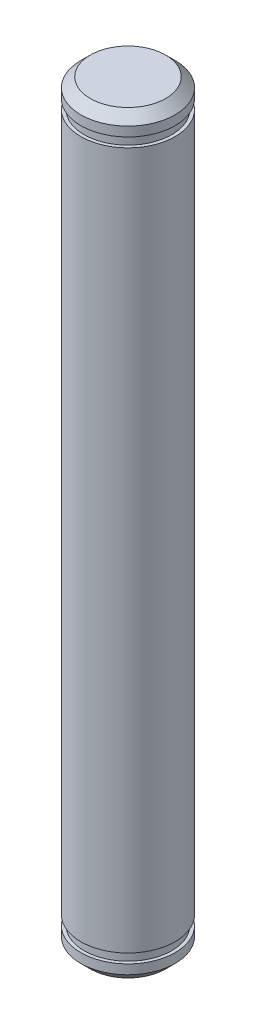
ISO-10303-21;
HEADER;
FILE_DESCRIPTION(('STEP AP214'),'2;1');
FILE_NAME('part.step','',(''),(''),'','','');
FILE_SCHEMA(('AUTOMOTIVE_DESIGN { 1 0 10303 214 1 1 1 1 }'));
ENDSEC;
DATA;
#1=APPLICATION_CONTEXT('core data for automotive mechanical design processes');
#2=APPLICATION_PROTOCOL_DEFINITION('international standard','automotive_design',2000,#1);
#3=PRODUCT_CONTEXT('',#1,'mechanical');
#4=PRODUCT('Part','Part','',(#3));
#5=PRODUCT_RELATED_PRODUCT_CATEGORY('part','',(#4));
#6=PRODUCT_DEFINITION_FORMATION('','',#4);
#7=PRODUCT_DEFINITION_CONTEXT('part definition',#1,'design');
#8=PRODUCT_DEFINITION('design','',#6,#7);
#9=PRODUCT_DEFINITION_SHAPE('','',#8);
#10=(LENGTH_UNIT() NAMED_UNIT(*) SI_UNIT(.MILLI.,.METRE.));
#11=(NAMED_UNIT(*) PLANE_ANGLE_UNIT() SI_UNIT($,.RADIAN.));
#12=(NAMED_UNIT(*) SI_UNIT($,.STERADIAN.) SOLID_ANGLE_UNIT());
#13=UNCERTAINTY_MEASURE_WITH_UNIT(LENGTH_MEASURE(1.E-05),#10,'distance_accuracy_value','');
#14=(GEOMETRIC_REPRESENTATION_CONTEXT(3) GLOBAL_UNCERTAINTY_ASSIGNED_CONTEXT((#13)) GLOBAL_UNIT_ASSIGNED_CONTEXT((#10,
#11,#12)) REPRESENTATION_CONTEXT('',''));
#15=CARTESIAN_POINT('',(0.,0.,0.));
#16=DIRECTION('',(0.,0.,1.));
#17=DIRECTION('',(1.,0.,0.));
#18=AXIS2_PLACEMENT_3D('',#15,#16,#17);
#19=CARTESIAN_POINT('',(0.,40.,0.));
#20=DIRECTION('',(0.,1.,0.));
#21=DIRECTION('',(-1.,0.,0.));
#22=AXIS2_PLACEMENT_3D('',#19,#20,#21);
#23=CYLINDRICAL_SURFACE('',#22,5.);
#24=CARTESIAN_POINT('',(0.,37.,0.));
#25=DIRECTION('',(0.,1.,0.));
#26=DIRECTION('',(-1.,0.,0.));
#27=AXIS2_PLACEMENT_3D('',#24,#25,#26);
#28=CIRCLE('',#27,5.);
#29=CARTESIAN_POINT('',(-5.00000000000002,37.,0.));
#30=VERTEX_POINT('',#29);
#31=EDGE_CURVE('E59',#30,#30,#28,.T.);
#32=ORIENTED_EDGE('',*,*,#31,.F.);
#33=EDGE_LOOP('',(#32));
#34=FACE_BOUND('',#33,.T.);
#35=CARTESIAN_POINT('',(0.,-37.,0.));
#36=DIRECTION('',(0.,1.,0.));
#37=DIRECTION('',(-1.,0.,0.));
#38=AXIS2_PLACEMENT_3D('',#35,#36,#37);
#39=CIRCLE('',#38,5.);
#40=CARTESIAN_POINT('',(-5.,-37.,0.));
#41=VERTEX_POINT('',#40);
#42=EDGE_CURVE('E71',#41,#41,#39,.T.);
#43=ORIENTED_EDGE('',*,*,#42,.T.);
#44=EDGE_LOOP('',(#43));
#45=FACE_BOUND('',#44,.T.);
#46=ADVANCED_FACE('F37',(#34,#45),#23,.T.);
#47=CARTESIAN_POINT('',(0.,40.,0.));
#48=DIRECTION('',(0.,-1.,0.));
#49=DIRECTION('',(1.,0.,0.));
#50=AXIS2_PLACEMENT_3D('',#47,#48,#49);
#51=PLANE('',#50);
#52=CARTESIAN_POINT('',(0.,40.,0.));
#53=DIRECTION('',(0.,-1.,0.));
#54=DIRECTION('',(1.,0.,0.));
#55=AXIS2_PLACEMENT_3D('',#52,#53,#54);
#56=CIRCLE('',#55,4.00000000000002);
#57=CARTESIAN_POINT('',(4.,40.,0.));
#58=VERTEX_POINT('',#57);
#59=EDGE_CURVE('E10',#58,#58,#56,.F.);
#60=ORIENTED_EDGE('',*,*,#59,.T.);
#61=EDGE_LOOP('',(#60));
#62=FACE_BOUND('',#61,.T.);
#63=ADVANCED_FACE('F113',(#62),#51,.F.);
#64=CARTESIAN_POINT('',(0.,38.,0.));
#65=DIRECTION('',(0.,1.,0.));
#66=DIRECTION('',(-1.,0.,0.));
#67=AXIS2_PLACEMENT_3D('',#64,#65,#66);
#68=CIRCLE('',#67,5.);
#69=CARTESIAN_POINT('',(-5.00000000000002,38.,0.));
#70=VERTEX_POINT('',#69);
#71=EDGE_CURVE('E58',#70,#70,#68,.T.);
#72=ORIENTED_EDGE('',*,*,#71,.T.);
#73=EDGE_LOOP('',(#72));
#74=FACE_BOUND('',#73,.T.);
#75=CARTESIAN_POINT('',(0.,39.,0.));
#76=DIRECTION('',(0.,-1.,0.));
#77=DIRECTION('',(1.,0.,0.));
#78=AXIS2_PLACEMENT_3D('',#75,#76,#77);
#79=CIRCLE('',#78,5.);
#80=CARTESIAN_POINT('',(4.99999999999999,39.,0.));
#81=VERTEX_POINT('',#80);
#82=EDGE_CURVE('E53',#81,#81,#79,.T.);
#83=ORIENTED_EDGE('',*,*,#82,.T.);
#84=EDGE_LOOP('',(#83));
#85=FACE_BOUND('',#84,.T.);
#86=ADVANCED_FACE('F99',(#74,#85),#23,.T.);
#87=CARTESIAN_POINT('',(0.,40.,0.));
#88=DIRECTION('',(0.,-1.,0.));
#89=DIRECTION('',(1.,0.,0.));
#90=AXIS2_PLACEMENT_3D('',#87,#88,#89);
#91=CONICAL_SURFACE('',#90,4.00000000000002,0.785398163397446);
#92=ORIENTED_EDGE('',*,*,#82,.F.);
#93=EDGE_LOOP('',(#92));
#94=FACE_BOUND('',#93,.T.);
#95=ORIENTED_EDGE('',*,*,#59,.F.);
#96=EDGE_LOOP('',(#95));
#97=FACE_BOUND('',#96,.T.);
#98=ADVANCED_FACE('F40',(#94,#97),#91,.T.);
#99=CARTESIAN_POINT('',(0.,38.,0.));
#100=DIRECTION('',(0.,1.,0.));
#101=DIRECTION('',(-1.,0.,0.));
#102=AXIS2_PLACEMENT_3D('',#99,#100,#101);
#103=PLANE('',#102);
#104=ORIENTED_EDGE('',*,*,#71,.F.);
#105=EDGE_LOOP('',(#104));
#106=FACE_BOUND('',#105,.T.);
#107=CARTESIAN_POINT('',(0.,38.,0.));
#108=DIRECTION('',(0.,1.,0.));
#109=DIRECTION('',(-1.,0.,0.));
#110=AXIS2_PLACEMENT_3D('',#107,#108,#109);
#111=CIRCLE('',#110,4.65);
#112=CARTESIAN_POINT('',(-4.65000000000001,38.,0.));
#113=VERTEX_POINT('',#112);
#114=EDGE_CURVE('E62',#113,#113,#111,.T.);
#115=ORIENTED_EDGE('',*,*,#114,.T.);
#116=EDGE_LOOP('',(#115));
#117=FACE_BOUND('',#116,.T.);
#118=ADVANCED_FACE('F128',(#106,#117),#103,.F.);
#119=CARTESIAN_POINT('',(0.,37.,0.));
#120=DIRECTION('',(0.,1.,0.));
#121=DIRECTION('',(-1.,0.,0.));
#122=AXIS2_PLACEMENT_3D('',#119,#120,#121);
#123=PLANE('',#122);
#124=ORIENTED_EDGE('',*,*,#31,.T.);
#125=EDGE_LOOP('',(#124));
#126=FACE_BOUND('',#125,.T.);
#127=CARTESIAN_POINT('',(0.,37.,0.));
#128=DIRECTION('',(0.,1.,0.));
#129=DIRECTION('',(-1.,0.,0.));
#130=AXIS2_PLACEMENT_3D('',#127,#128,#129);
#131=CIRCLE('',#130,4.65);
#132=CARTESIAN_POINT('',(-4.65000000000001,37.,0.));
#133=VERTEX_POINT('',#132);
#134=EDGE_CURVE('E65',#133,#133,#131,.T.);
#135=ORIENTED_EDGE('',*,*,#134,.F.);
#136=EDGE_LOOP('',(#135));
#137=FACE_BOUND('',#136,.T.);
#138=ADVANCED_FACE('F137',(#126,#137),#123,.T.);
#139=CARTESIAN_POINT('',(0.,38.,0.));
#140=DIRECTION('',(0.,-1.,0.));
#141=DIRECTION('',(1.,0.,0.));
#142=AXIS2_PLACEMENT_3D('',#139,#140,#141);
#143=CYLINDRICAL_SURFACE('',#142,4.65);
#144=ORIENTED_EDGE('',*,*,#114,.F.);
#145=EDGE_LOOP('',(#144));
#146=FACE_BOUND('',#145,.T.);
#147=ORIENTED_EDGE('',*,*,#134,.T.);
#148=EDGE_LOOP('',(#147));
#149=FACE_BOUND('',#148,.T.);
#150=ADVANCED_FACE('F90',(#146,#149),#143,.T.);
#151=CARTESIAN_POINT('',(0.,-38.,0.));
#152=DIRECTION('',(0.,-1.,0.));
#153=DIRECTION('',(-1.,0.,0.));
#154=AXIS2_PLACEMENT_3D('',#151,#152,#153);
#155=PLANE('',#154);
#156=CARTESIAN_POINT('',(0.,-38.,0.));
#157=DIRECTION('',(0.,1.,0.));
#158=DIRECTION('',(-1.,0.,0.));
#159=AXIS2_PLACEMENT_3D('',#156,#157,#158);
#160=CIRCLE('',#159,4.65);
#161=CARTESIAN_POINT('',(-4.64999999999999,-38.,0.));
#162=VERTEX_POINT('',#161);
#163=EDGE_CURVE('E74',#162,#162,#160,.T.);
#164=ORIENTED_EDGE('',*,*,#163,.F.);
#165=EDGE_LOOP('',(#164));
#166=FACE_BOUND('',#165,.T.);
#167=CARTESIAN_POINT('',(0.,-38.,0.));
#168=DIRECTION('',(0.,1.,0.));
#169=DIRECTION('',(-1.,0.,0.));
#170=AXIS2_PLACEMENT_3D('',#167,#168,#169);
#171=CIRCLE('',#170,5.);
#172=CARTESIAN_POINT('',(-5.,-38.,0.));
#173=VERTEX_POINT('',#172);
#174=EDGE_CURVE('E68',#173,#173,#171,.T.);
#175=ORIENTED_EDGE('',*,*,#174,.T.);
#176=EDGE_LOOP('',(#175));
#177=FACE_BOUND('',#176,.T.);
#178=ADVANCED_FACE('F86',(#166,#177),#155,.F.);
#179=CARTESIAN_POINT('',(0.,-37.,0.));
#180=DIRECTION('',(0.,-1.,0.));
#181=DIRECTION('',(-1.,0.,0.));
#182=AXIS2_PLACEMENT_3D('',#179,#180,#181);
#183=PLANE('',#182);
#184=CARTESIAN_POINT('',(0.,-37.,0.));
#185=DIRECTION('',(0.,1.,0.));
#186=DIRECTION('',(-1.,0.,0.));
#187=AXIS2_PLACEMENT_3D('',#184,#185,#186);
#188=CIRCLE('',#187,4.65);
#189=CARTESIAN_POINT('',(-4.64999999999999,-37.,0.));
#190=VERTEX_POINT('',#189);
#191=EDGE_CURVE('E77',#190,#190,#188,.T.);
#192=ORIENTED_EDGE('',*,*,#191,.T.);
#193=EDGE_LOOP('',(#192));
#194=FACE_BOUND('',#193,.T.);
#195=ORIENTED_EDGE('',*,*,#42,.F.);
#196=EDGE_LOOP('',(#195));
#197=FACE_BOUND('',#196,.T.);
#198=ADVANCED_FACE('F89',(#194,#197),#183,.T.);
#199=CARTESIAN_POINT('',(0.,-38.,0.));
#200=DIRECTION('',(0.,1.,0.));
#201=DIRECTION('',(-1.,0.,0.));
#202=AXIS2_PLACEMENT_3D('',#199,#200,#201);
#203=CYLINDRICAL_SURFACE('',#202,4.65);
#204=ORIENTED_EDGE('',*,*,#163,.T.);
#205=EDGE_LOOP('',(#204));
#206=FACE_BOUND('',#205,.T.);
#207=ORIENTED_EDGE('',*,*,#191,.F.);
#208=EDGE_LOOP('',(#207));
#209=FACE_BOUND('',#208,.T.);
#210=ADVANCED_FACE('F83',(#206,#209),#203,.T.);
#211=CARTESIAN_POINT('',(5.00000000000001,-40.,0.));
#212=DIRECTION('',(0.,1.,0.));
#213=DIRECTION('',(-1.,0.,0.));
#214=AXIS2_PLACEMENT_3D('',#211,#212,#213);
#215=PLANE('',#214);
#216=CARTESIAN_POINT('',(0.,-40.,0.));
#217=DIRECTION('',(0.,1.,0.));
#218=DIRECTION('',(-1.,0.,0.));
#219=AXIS2_PLACEMENT_3D('',#216,#217,#218);
#220=CIRCLE('',#219,3.99999999999998);
#221=CARTESIAN_POINT('',(-3.99999999999997,-40.,0.));
#222=VERTEX_POINT('',#221);
#223=EDGE_CURVE('E45',#222,#222,#220,.F.);
#224=ORIENTED_EDGE('',*,*,#223,.T.);
#225=EDGE_LOOP('',(#224));
#226=FACE_BOUND('',#225,.T.);
#227=ADVANCED_FACE('F103',(#226),#215,.F.);
#228=CARTESIAN_POINT('',(0.,-39.,0.));
#229=DIRECTION('',(0.,1.,0.));
#230=DIRECTION('',(-1.,0.,0.));
#231=AXIS2_PLACEMENT_3D('',#228,#229,#230);
#232=CONICAL_SURFACE('',#231,5.,0.785398163397453);
#233=ORIENTED_EDGE('',*,*,#223,.F.);
#234=EDGE_LOOP('',(#233));
#235=FACE_BOUND('',#234,.T.);
#236=CARTESIAN_POINT('',(0.,-39.,0.));
#237=DIRECTION('',(0.,1.,0.));
#238=DIRECTION('',(-1.,0.,0.));
#239=AXIS2_PLACEMENT_3D('',#236,#237,#238);
#240=CIRCLE('',#239,5.);
#241=CARTESIAN_POINT('',(-5.,-39.,0.));
#242=VERTEX_POINT('',#241);
#243=EDGE_CURVE('E49',#242,#242,#240,.T.);
#244=ORIENTED_EDGE('',*,*,#243,.F.);
#245=EDGE_LOOP('',(#244));
#246=FACE_BOUND('',#245,.T.);
#247=ADVANCED_FACE('F97',(#235,#246),#232,.T.);
#248=ORIENTED_EDGE('',*,*,#174,.F.);
#249=EDGE_LOOP('',(#248));
#250=FACE_BOUND('',#249,.T.);
#251=ORIENTED_EDGE('',*,*,#243,.T.);
#252=EDGE_LOOP('',(#251));
#253=FACE_BOUND('',#252,.T.);
#254=ADVANCED_FACE('F94',(#250,#253),#23,.T.);
#255=CLOSED_SHELL('',(#46,#63,#86,#98,#118,#138,#150,#178,#198,#210,#227,#247,#254));
#256=MANIFOLD_SOLID_BREP('B2',#255);
#257=ADVANCED_BREP_SHAPE_REPRESENTATION('',(#18,#256),#14);
#258=SHAPE_DEFINITION_REPRESENTATION(#9,#257);
ENDSEC;
END-ISO-10303-21;
